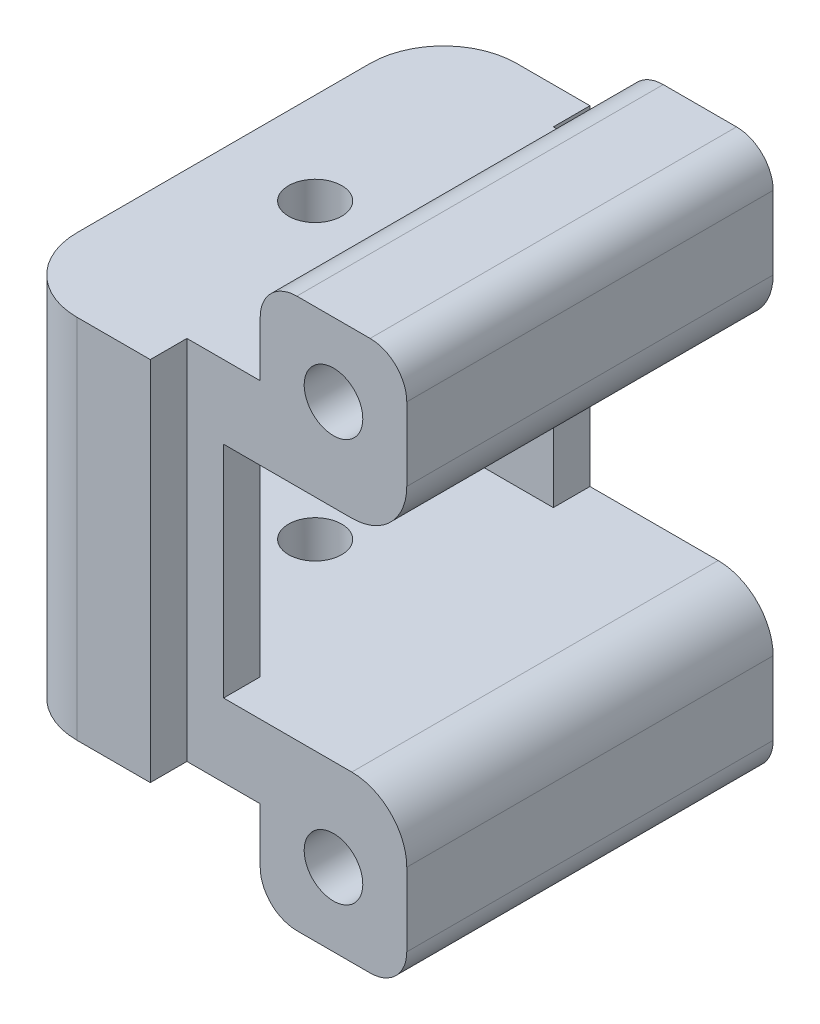
ISO-10303-21;
HEADER;
FILE_DESCRIPTION(('STEP AP214'),'2;1');
FILE_NAME('part.step','',(''),(''),'','','');
FILE_SCHEMA(('AUTOMOTIVE_DESIGN { 1 0 10303 214 1 1 1 1 }'));
ENDSEC;
DATA;
#1=APPLICATION_CONTEXT('core data for automotive mechanical design processes');
#2=APPLICATION_PROTOCOL_DEFINITION('international standard','automotive_design',2000,#1);
#3=PRODUCT_CONTEXT('',#1,'mechanical');
#4=PRODUCT('Part','Part','',(#3));
#5=PRODUCT_RELATED_PRODUCT_CATEGORY('part','',(#4));
#6=PRODUCT_DEFINITION_FORMATION('','',#4);
#7=PRODUCT_DEFINITION_CONTEXT('part definition',#1,'design');
#8=PRODUCT_DEFINITION('design','',#6,#7);
#9=PRODUCT_DEFINITION_SHAPE('','',#8);
#10=(LENGTH_UNIT() NAMED_UNIT(*) SI_UNIT(.MILLI.,.METRE.));
#11=(NAMED_UNIT(*) PLANE_ANGLE_UNIT() SI_UNIT($,.RADIAN.));
#12=(NAMED_UNIT(*) SI_UNIT($,.STERADIAN.) SOLID_ANGLE_UNIT());
#13=UNCERTAINTY_MEASURE_WITH_UNIT(LENGTH_MEASURE(1.E-05),#10,'distance_accuracy_value','');
#14=(GEOMETRIC_REPRESENTATION_CONTEXT(3) GLOBAL_UNCERTAINTY_ASSIGNED_CONTEXT((#13)) GLOBAL_UNIT_ASSIGNED_CONTEXT((#10,
#11,#12)) REPRESENTATION_CONTEXT('',''));
#15=CARTESIAN_POINT('',(0.,0.,0.));
#16=DIRECTION('',(0.,0.,1.));
#17=DIRECTION('',(1.,0.,0.));
#18=AXIS2_PLACEMENT_3D('',#15,#16,#17);
#19=CARTESIAN_POINT('',(6.,0.,0.));
#20=DIRECTION('',(1.,0.,0.));
#21=DIRECTION('',(0.,0.,-1.));
#22=AXIS2_PLACEMENT_3D('',#19,#20,#21);
#23=PLANE('',#22);
#24=DIRECTION('',(0.,0.,1.));
#25=VECTOR('',#24,1.);
#26=CARTESIAN_POINT('',(6.,0.,0.));
#27=LINE('',#26,#25);
#28=CARTESIAN_POINT('',(6.,0.,2.));
#29=VERTEX_POINT('',#28);
#30=CARTESIAN_POINT('',(6.,0.,18.));
#31=VERTEX_POINT('',#30);
#32=EDGE_CURVE('E225',#29,#31,#27,.T.);
#33=ORIENTED_EDGE('',*,*,#32,.F.);
#34=DIRECTION('',(0.,1.,0.));
#35=VECTOR('',#34,1.);
#36=CARTESIAN_POINT('',(6.,-20.,2.));
#37=LINE('',#36,#35);
#38=CARTESIAN_POINT('',(6.,-4.00000000000002,2.));
#39=VERTEX_POINT('',#38);
#40=EDGE_CURVE('E220',#29,#39,#37,.F.);
#41=ORIENTED_EDGE('',*,*,#40,.T.);
#42=DIRECTION('',(0.,0.,-1.));
#43=VECTOR('',#42,1.);
#44=CARTESIAN_POINT('',(6.,-4.,0.));
#45=LINE('',#44,#43);
#46=CARTESIAN_POINT('',(6.,-4.00000000000001,18.));
#47=VERTEX_POINT('',#46);
#48=EDGE_CURVE('E222',#47,#39,#45,.T.);
#49=ORIENTED_EDGE('',*,*,#48,.F.);
#50=DIRECTION('',(0.,-1.,0.));
#51=VECTOR('',#50,1.);
#52=CARTESIAN_POINT('',(6.,0.,18.));
#53=LINE('',#52,#51);
#54=EDGE_CURVE('E461',#47,#31,#53,.F.);
#55=ORIENTED_EDGE('',*,*,#54,.T.);
#56=EDGE_LOOP('',(#33,#41,#49,#55));
#57=FACE_BOUND('',#56,.T.);
#58=ADVANCED_FACE('F35',(#57),#23,.F.);
#59=CARTESIAN_POINT('',(4.,0.,0.));
#60=DIRECTION('',(0.,0.,1.));
#61=DIRECTION('',(0.,-1.,0.));
#62=AXIS2_PLACEMENT_3D('',#59,#60,#61);
#63=PLANE('',#62);
#64=CARTESIAN_POINT('',(22.,1.,0.));
#65=DIRECTION('',(0.,0.,-1.));
#66=DIRECTION('',(0.,1.,0.));
#67=AXIS2_PLACEMENT_3D('',#64,#65,#66);
#68=CIRCLE('',#67,1.6);
#69=CARTESIAN_POINT('',(22.,2.6,0.));
#70=VERTEX_POINT('',#69);
#71=EDGE_CURVE('E320',#70,#70,#68,.T.);
#72=ORIENTED_EDGE('',*,*,#71,.F.);
#73=EDGE_LOOP('',(#72));
#74=FACE_BOUND('',#73,.T.);
#75=CARTESIAN_POINT('',(21.9999999999991,-21.,0.));
#76=DIRECTION('',(0.,0.,-1.));
#77=DIRECTION('',(0.,1.,0.));
#78=AXIS2_PLACEMENT_3D('',#75,#76,#77);
#79=CIRCLE('',#78,1.6);
#80=CARTESIAN_POINT('',(21.9999999999991,-19.4,0.));
#81=VERTEX_POINT('',#80);
#82=EDGE_CURVE('E316',#81,#81,#79,.T.);
#83=ORIENTED_EDGE('',*,*,#82,.F.);
#84=EDGE_LOOP('',(#83));
#85=FACE_BOUND('',#84,.T.);
#86=DIRECTION('',(1.,0.,0.));
#87=VECTOR('',#86,1.);
#88=CARTESIAN_POINT('',(26.,-25.,0.));
#89=LINE('',#88,#87);
#90=CARTESIAN_POINT('',(20.,-25.,0.));
#91=VERTEX_POINT('',#90);
#92=CARTESIAN_POINT('',(24.,-25.,0.));
#93=VERTEX_POINT('',#92);
#94=EDGE_CURVE('E345',#91,#93,#89,.T.);
#95=ORIENTED_EDGE('',*,*,#94,.F.);
#96=CARTESIAN_POINT('',(20.,-23.,0.));
#97=DIRECTION('',(0.,0.,1.));
#98=DIRECTION('',(0.,-1.,0.));
#99=AXIS2_PLACEMENT_3D('',#96,#97,#98);
#100=CIRCLE('',#99,2.);
#101=CARTESIAN_POINT('',(18.,-23.,0.));
#102=VERTEX_POINT('',#101);
#103=EDGE_CURVE('E430',#91,#102,#100,.F.);
#104=ORIENTED_EDGE('',*,*,#103,.T.);
#105=DIRECTION('',(0.,1.,0.));
#106=VECTOR('',#105,1.);
#107=CARTESIAN_POINT('',(18.,-25.,0.));
#108=LINE('',#107,#106);
#109=CARTESIAN_POINT('',(18.,-20.,0.));
#110=VERTEX_POINT('',#109);
#111=EDGE_CURVE('E348',#102,#110,#108,.T.);
#112=ORIENTED_EDGE('',*,*,#111,.T.);
#113=DIRECTION('',(-1.,0.,0.));
#114=VECTOR('',#113,1.);
#115=CARTESIAN_POINT('',(4.,-20.,0.));
#116=LINE('',#115,#114);
#117=CARTESIAN_POINT('',(14.,-20.,0.));
#118=VERTEX_POINT('',#117);
#119=EDGE_CURVE('E384',#110,#118,#116,.T.);
#120=ORIENTED_EDGE('',*,*,#119,.T.);
#121=DIRECTION('',(0.,-1.,0.));
#122=VECTOR('',#121,1.);
#123=CARTESIAN_POINT('',(14.,-20.,0.));
#124=LINE('',#123,#122);
#125=CARTESIAN_POINT('',(14.,0.,0.));
#126=VERTEX_POINT('',#125);
#127=EDGE_CURVE('E269',#126,#118,#124,.T.);
#128=ORIENTED_EDGE('',*,*,#127,.F.);
#129=DIRECTION('',(-1.,0.,0.));
#130=VECTOR('',#129,1.);
#131=CARTESIAN_POINT('',(4.,0.,0.));
#132=LINE('',#131,#130);
#133=CARTESIAN_POINT('',(18.,0.,0.));
#134=VERTEX_POINT('',#133);
#135=EDGE_CURVE('E391',#134,#126,#132,.T.);
#136=ORIENTED_EDGE('',*,*,#135,.F.);
#137=DIRECTION('',(0.,-1.,0.));
#138=VECTOR('',#137,1.);
#139=CARTESIAN_POINT('',(18.,5.,0.));
#140=LINE('',#139,#138);
#141=CARTESIAN_POINT('',(18.,3.,0.));
#142=VERTEX_POINT('',#141);
#143=EDGE_CURVE('E339',#142,#134,#140,.T.);
#144=ORIENTED_EDGE('',*,*,#143,.F.);
#145=CARTESIAN_POINT('',(20.,3.,0.));
#146=DIRECTION('',(0.,0.,1.));
#147=DIRECTION('',(0.,-1.,0.));
#148=AXIS2_PLACEMENT_3D('',#145,#146,#147);
#149=CIRCLE('',#148,2.);
#150=CARTESIAN_POINT('',(20.,5.,0.));
#151=VERTEX_POINT('',#150);
#152=EDGE_CURVE('E426',#142,#151,#149,.F.);
#153=ORIENTED_EDGE('',*,*,#152,.T.);
#154=DIRECTION('',(-1.,0.,0.));
#155=VECTOR('',#154,1.);
#156=CARTESIAN_POINT('',(26.,5.,0.));
#157=LINE('',#156,#155);
#158=CARTESIAN_POINT('',(24.,5.,0.));
#159=VERTEX_POINT('',#158);
#160=EDGE_CURVE('E329',#159,#151,#157,.T.);
#161=ORIENTED_EDGE('',*,*,#160,.F.);
#162=CARTESIAN_POINT('',(24.,3.,0.));
#163=DIRECTION('',(0.,0.,1.));
#164=DIRECTION('',(0.,-1.,0.));
#165=AXIS2_PLACEMENT_3D('',#162,#163,#164);
#166=CIRCLE('',#165,2.);
#167=CARTESIAN_POINT('',(26.,3.,0.));
#168=VERTEX_POINT('',#167);
#169=EDGE_CURVE('E424',#159,#168,#166,.F.);
#170=ORIENTED_EDGE('',*,*,#169,.T.);
#171=DIRECTION('',(0.,1.,0.));
#172=VECTOR('',#171,1.);
#173=CARTESIAN_POINT('',(26.,0.,0.));
#174=LINE('',#173,#172);
#175=CARTESIAN_POINT('',(26.,-1.,0.));
#176=VERTEX_POINT('',#175);
#177=EDGE_CURVE('E355',#176,#168,#174,.T.);
#178=ORIENTED_EDGE('',*,*,#177,.F.);
#179=CARTESIAN_POINT('',(23.,-1.,0.));
#180=DIRECTION('',(0.,0.,1.));
#181=DIRECTION('',(0.,-1.,0.));
#182=AXIS2_PLACEMENT_3D('',#179,#180,#181);
#183=CIRCLE('',#182,3.);
#184=CARTESIAN_POINT('',(23.,-4.,0.));
#185=VERTEX_POINT('',#184);
#186=EDGE_CURVE('E408',#176,#185,#183,.F.);
#187=ORIENTED_EDGE('',*,*,#186,.T.);
#188=DIRECTION('',(-1.,0.,0.));
#189=VECTOR('',#188,1.);
#190=CARTESIAN_POINT('',(26.,-4.,0.));
#191=LINE('',#190,#189);
#192=CARTESIAN_POINT('',(16.,-4.,0.));
#193=VERTEX_POINT('',#192);
#194=EDGE_CURVE('E360',#185,#193,#191,.T.);
#195=ORIENTED_EDGE('',*,*,#194,.T.);
#196=DIRECTION('',(0.,1.,0.));
#197=VECTOR('',#196,1.);
#198=CARTESIAN_POINT('',(16.,0.,0.));
#199=LINE('',#198,#197);
#200=CARTESIAN_POINT('',(16.,-16.,0.));
#201=VERTEX_POINT('',#200);
#202=EDGE_CURVE('E378',#201,#193,#199,.T.);
#203=ORIENTED_EDGE('',*,*,#202,.F.);
#204=DIRECTION('',(-1.,0.,0.));
#205=VECTOR('',#204,1.);
#206=CARTESIAN_POINT('',(26.,-16.,0.));
#207=LINE('',#206,#205);
#208=CARTESIAN_POINT('',(23.,-16.,0.));
#209=VERTEX_POINT('',#208);
#210=EDGE_CURVE('E376',#209,#201,#207,.T.);
#211=ORIENTED_EDGE('',*,*,#210,.F.);
#212=CARTESIAN_POINT('',(23.,-19.,0.));
#213=DIRECTION('',(0.,0.,1.));
#214=DIRECTION('',(0.,-1.,0.));
#215=AXIS2_PLACEMENT_3D('',#212,#213,#214);
#216=CIRCLE('',#215,3.);
#217=CARTESIAN_POINT('',(26.,-19.,0.));
#218=VERTEX_POINT('',#217);
#219=EDGE_CURVE('E410',#209,#218,#216,.F.);
#220=ORIENTED_EDGE('',*,*,#219,.T.);
#221=DIRECTION('',(0.,1.,0.));
#222=VECTOR('',#221,1.);
#223=CARTESIAN_POINT('',(26.,-20.,0.));
#224=LINE('',#223,#222);
#225=CARTESIAN_POINT('',(26.,-23.,0.));
#226=VERTEX_POINT('',#225);
#227=EDGE_CURVE('E366',#226,#218,#224,.T.);
#228=ORIENTED_EDGE('',*,*,#227,.F.);
#229=CARTESIAN_POINT('',(24.,-23.,0.));
#230=DIRECTION('',(0.,0.,1.));
#231=DIRECTION('',(0.,-1.,0.));
#232=AXIS2_PLACEMENT_3D('',#229,#230,#231);
#233=CIRCLE('',#232,2.);
#234=EDGE_CURVE('E428',#226,#93,#233,.F.);
#235=ORIENTED_EDGE('',*,*,#234,.T.);
#236=EDGE_LOOP('',(#95,#104,#112,#120,#128,#136,#144,#153,#161,#170,#178,#187,#195,#203,#211,
#220,#228,#235));
#237=FACE_BOUND('',#236,.T.);
#238=ADVANCED_FACE('F502',(#74,#85,#237),#63,.F.);
#239=CARTESIAN_POINT('',(4.,0.,20.));
#240=DIRECTION('',(0.,0.,-1.));
#241=DIRECTION('',(-1.,0.,0.));
#242=AXIS2_PLACEMENT_3D('',#239,#240,#241);
#243=PLANE('',#242);
#244=CARTESIAN_POINT('',(22.,1.,20.));
#245=DIRECTION('',(0.,0.,-1.));
#246=DIRECTION('',(0.,1.,0.));
#247=AXIS2_PLACEMENT_3D('',#244,#245,#246);
#248=CIRCLE('',#247,1.6);
#249=CARTESIAN_POINT('',(22.,2.6,20.));
#250=VERTEX_POINT('',#249);
#251=EDGE_CURVE('E323',#250,#250,#248,.T.);
#252=ORIENTED_EDGE('',*,*,#251,.T.);
#253=EDGE_LOOP('',(#252));
#254=FACE_BOUND('',#253,.T.);
#255=CARTESIAN_POINT('',(21.9999999999991,-21.,20.));
#256=DIRECTION('',(0.,0.,-1.));
#257=DIRECTION('',(0.,1.,0.));
#258=AXIS2_PLACEMENT_3D('',#255,#256,#257);
#259=CIRCLE('',#258,1.6);
#260=CARTESIAN_POINT('',(21.9999999999991,-19.4,20.));
#261=VERTEX_POINT('',#260);
#262=EDGE_CURVE('E317',#261,#261,#259,.T.);
#263=ORIENTED_EDGE('',*,*,#262,.T.);
#264=EDGE_LOOP('',(#263));
#265=FACE_BOUND('',#264,.T.);
#266=DIRECTION('',(0.,1.,0.));
#267=VECTOR('',#266,1.);
#268=CARTESIAN_POINT('',(18.,-25.,20.));
#269=LINE('',#268,#267);
#270=CARTESIAN_POINT('',(18.,-23.,20.));
#271=VERTEX_POINT('',#270);
#272=CARTESIAN_POINT('',(18.,-20.,20.));
#273=VERTEX_POINT('',#272);
#274=EDGE_CURVE('E352',#271,#273,#269,.T.);
#275=ORIENTED_EDGE('',*,*,#274,.F.);
#276=CARTESIAN_POINT('',(20.,-23.,20.));
#277=DIRECTION('',(0.,0.,-1.));
#278=DIRECTION('',(-1.,0.,0.));
#279=AXIS2_PLACEMENT_3D('',#276,#277,#278);
#280=CIRCLE('',#279,2.);
#281=CARTESIAN_POINT('',(20.,-25.,20.));
#282=VERTEX_POINT('',#281);
#283=EDGE_CURVE('E440',#271,#282,#280,.F.);
#284=ORIENTED_EDGE('',*,*,#283,.T.);
#285=DIRECTION('',(-1.,0.,0.));
#286=VECTOR('',#285,1.);
#287=CARTESIAN_POINT('',(26.,-25.,20.));
#288=LINE('',#287,#286);
#289=CARTESIAN_POINT('',(24.,-25.,20.));
#290=VERTEX_POINT('',#289);
#291=EDGE_CURVE('E342',#290,#282,#288,.T.);
#292=ORIENTED_EDGE('',*,*,#291,.F.);
#293=CARTESIAN_POINT('',(24.,-23.,20.));
#294=DIRECTION('',(0.,0.,-1.));
#295=DIRECTION('',(-1.,0.,0.));
#296=AXIS2_PLACEMENT_3D('',#293,#294,#295);
#297=CIRCLE('',#296,2.);
#298=CARTESIAN_POINT('',(26.,-23.,20.));
#299=VERTEX_POINT('',#298);
#300=EDGE_CURVE('E438',#290,#299,#297,.F.);
#301=ORIENTED_EDGE('',*,*,#300,.T.);
#302=DIRECTION('',(0.,-1.,0.));
#303=VECTOR('',#302,1.);
#304=CARTESIAN_POINT('',(26.,-20.,20.));
#305=LINE('',#304,#303);
#306=CARTESIAN_POINT('',(26.,-19.,20.));
#307=VERTEX_POINT('',#306);
#308=EDGE_CURVE('E368',#307,#299,#305,.T.);
#309=ORIENTED_EDGE('',*,*,#308,.F.);
#310=CARTESIAN_POINT('',(23.,-19.,20.));
#311=DIRECTION('',(0.,0.,-1.));
#312=DIRECTION('',(-1.,0.,0.));
#313=AXIS2_PLACEMENT_3D('',#310,#311,#312);
#314=CIRCLE('',#313,3.);
#315=CARTESIAN_POINT('',(23.,-16.,20.));
#316=VERTEX_POINT('',#315);
#317=EDGE_CURVE('E404',#307,#316,#314,.F.);
#318=ORIENTED_EDGE('',*,*,#317,.T.);
#319=DIRECTION('',(-1.,0.,0.));
#320=VECTOR('',#319,1.);
#321=CARTESIAN_POINT('',(26.,-16.,20.));
#322=LINE('',#321,#320);
#323=CARTESIAN_POINT('',(16.,-16.,20.));
#324=VERTEX_POINT('',#323);
#325=EDGE_CURVE('E371',#316,#324,#322,.T.);
#326=ORIENTED_EDGE('',*,*,#325,.T.);
#327=DIRECTION('',(0.,-1.,0.));
#328=VECTOR('',#327,1.);
#329=CARTESIAN_POINT('',(16.,0.,20.));
#330=LINE('',#329,#328);
#331=CARTESIAN_POINT('',(16.,-4.,20.));
#332=VERTEX_POINT('',#331);
#333=EDGE_CURVE('E381',#332,#324,#330,.T.);
#334=ORIENTED_EDGE('',*,*,#333,.F.);
#335=DIRECTION('',(-1.,0.,0.));
#336=VECTOR('',#335,1.);
#337=CARTESIAN_POINT('',(26.,-4.,20.));
#338=LINE('',#337,#336);
#339=CARTESIAN_POINT('',(23.,-4.,20.));
#340=VERTEX_POINT('',#339);
#341=EDGE_CURVE('E363',#340,#332,#338,.T.);
#342=ORIENTED_EDGE('',*,*,#341,.F.);
#343=CARTESIAN_POINT('',(23.,-1.,20.));
#344=DIRECTION('',(0.,0.,-1.));
#345=DIRECTION('',(-1.,0.,0.));
#346=AXIS2_PLACEMENT_3D('',#343,#344,#345);
#347=CIRCLE('',#346,3.);
#348=CARTESIAN_POINT('',(26.,-1.,20.));
#349=VERTEX_POINT('',#348);
#350=EDGE_CURVE('E401',#340,#349,#347,.F.);
#351=ORIENTED_EDGE('',*,*,#350,.T.);
#352=DIRECTION('',(0.,-1.,0.));
#353=VECTOR('',#352,1.);
#354=CARTESIAN_POINT('',(26.,0.,20.));
#355=LINE('',#354,#353);
#356=CARTESIAN_POINT('',(26.,3.,20.));
#357=VERTEX_POINT('',#356);
#358=EDGE_CURVE('E358',#357,#349,#355,.T.);
#359=ORIENTED_EDGE('',*,*,#358,.F.);
#360=CARTESIAN_POINT('',(24.,3.,20.));
#361=DIRECTION('',(0.,0.,-1.));
#362=DIRECTION('',(-1.,0.,0.));
#363=AXIS2_PLACEMENT_3D('',#360,#361,#362);
#364=CIRCLE('',#363,2.);
#365=CARTESIAN_POINT('',(24.,5.,20.));
#366=VERTEX_POINT('',#365);
#367=EDGE_CURVE('E434',#357,#366,#364,.F.);
#368=ORIENTED_EDGE('',*,*,#367,.T.);
#369=DIRECTION('',(1.,0.,0.));
#370=VECTOR('',#369,1.);
#371=CARTESIAN_POINT('',(26.,5.,20.));
#372=LINE('',#371,#370);
#373=CARTESIAN_POINT('',(20.,5.,20.));
#374=VERTEX_POINT('',#373);
#375=EDGE_CURVE('E332',#374,#366,#372,.T.);
#376=ORIENTED_EDGE('',*,*,#375,.F.);
#377=CARTESIAN_POINT('',(20.,3.,20.));
#378=DIRECTION('',(0.,0.,-1.));
#379=DIRECTION('',(-1.,0.,0.));
#380=AXIS2_PLACEMENT_3D('',#377,#378,#379);
#381=CIRCLE('',#380,2.);
#382=CARTESIAN_POINT('',(18.,3.,20.));
#383=VERTEX_POINT('',#382);
#384=EDGE_CURVE('E436',#374,#383,#381,.F.);
#385=ORIENTED_EDGE('',*,*,#384,.T.);
#386=DIRECTION('',(0.,-1.,0.));
#387=VECTOR('',#386,1.);
#388=CARTESIAN_POINT('',(18.,5.,20.));
#389=LINE('',#388,#387);
#390=CARTESIAN_POINT('',(18.,0.,20.));
#391=VERTEX_POINT('',#390);
#392=EDGE_CURVE('E335',#383,#391,#389,.T.);
#393=ORIENTED_EDGE('',*,*,#392,.T.);
#394=DIRECTION('',(-1.,0.,0.));
#395=VECTOR('',#394,1.);
#396=CARTESIAN_POINT('',(4.,0.,20.));
#397=LINE('',#396,#395);
#398=CARTESIAN_POINT('',(14.,0.,20.));
#399=VERTEX_POINT('',#398);
#400=EDGE_CURVE('E389',#391,#399,#397,.T.);
#401=ORIENTED_EDGE('',*,*,#400,.T.);
#402=DIRECTION('',(0.,1.,0.));
#403=VECTOR('',#402,1.);
#404=CARTESIAN_POINT('',(14.,-20.,20.));
#405=LINE('',#404,#403);
#406=CARTESIAN_POINT('',(14.,-20.,20.));
#407=VERTEX_POINT('',#406);
#408=EDGE_CURVE('E285',#407,#399,#405,.T.);
#409=ORIENTED_EDGE('',*,*,#408,.F.);
#410=DIRECTION('',(-1.,0.,0.));
#411=VECTOR('',#410,1.);
#412=CARTESIAN_POINT('',(4.,-20.,20.));
#413=LINE('',#412,#411);
#414=EDGE_CURVE('E386',#273,#407,#413,.T.);
#415=ORIENTED_EDGE('',*,*,#414,.F.);
#416=EDGE_LOOP('',(#275,#284,#292,#301,#309,#318,#326,#334,#342,#351,#359,#368,#376,#385,#393,
#401,#409,#415));
#417=FACE_BOUND('',#416,.T.);
#418=ADVANCED_FACE('F493',(#254,#265,#417),#243,.F.);
#419=CARTESIAN_POINT('',(4.,0.,0.));
#420=DIRECTION('',(0.,-1.,0.));
#421=DIRECTION('',(0.,0.,-1.));
#422=AXIS2_PLACEMENT_3D('',#419,#420,#421);
#423=PLANE('',#422);
#424=CARTESIAN_POINT('',(11.,0.,10.));
#425=DIRECTION('',(0.,1.,0.));
#426=DIRECTION('',(0.,0.,1.));
#427=AXIS2_PLACEMENT_3D('',#424,#425,#426);
#428=CIRCLE('',#427,1.45);
#429=CARTESIAN_POINT('',(11.,0.,11.45));
#430=VERTEX_POINT('',#429);
#431=EDGE_CURVE('E301',#430,#430,#428,.T.);
#432=ORIENTED_EDGE('',*,*,#431,.F.);
#433=EDGE_LOOP('',(#432));
#434=FACE_BOUND('',#433,.T.);
#435=DIRECTION('',(1.,0.,0.));
#436=VECTOR('',#435,1.);
#437=CARTESIAN_POINT('',(6.,0.,-2.));
#438=LINE('',#437,#436);
#439=CARTESIAN_POINT('',(10.,0.,-2.));
#440=VERTEX_POINT('',#439);
#441=CARTESIAN_POINT('',(14.,0.,-2.));
#442=VERTEX_POINT('',#441);
#443=EDGE_CURVE('E270',#440,#442,#438,.T.);
#444=ORIENTED_EDGE('',*,*,#443,.F.);
#445=CARTESIAN_POINT('',(10.,0.,2.));
#446=DIRECTION('',(0.,-1.,0.));
#447=DIRECTION('',(0.,0.,-1.));
#448=AXIS2_PLACEMENT_3D('',#445,#446,#447);
#449=CIRCLE('',#448,4.);
#450=EDGE_CURVE('E459',#440,#29,#449,.F.);
#451=ORIENTED_EDGE('',*,*,#450,.T.);
#452=ORIENTED_EDGE('',*,*,#32,.T.);
#453=CARTESIAN_POINT('',(10.,0.,18.));
#454=DIRECTION('',(0.,-1.,0.));
#455=DIRECTION('',(0.,0.,-1.));
#456=AXIS2_PLACEMENT_3D('',#453,#454,#455);
#457=CIRCLE('',#456,4.);
#458=CARTESIAN_POINT('',(10.,0.,22.));
#459=VERTEX_POINT('',#458);
#460=EDGE_CURVE('E457',#31,#459,#457,.F.);
#461=ORIENTED_EDGE('',*,*,#460,.T.);
#462=DIRECTION('',(-1.,0.,0.));
#463=VECTOR('',#462,1.);
#464=CARTESIAN_POINT('',(6.,0.,22.));
#465=LINE('',#464,#463);
#466=CARTESIAN_POINT('',(14.,0.,22.));
#467=VERTEX_POINT('',#466);
#468=EDGE_CURVE('E290',#467,#459,#465,.T.);
#469=ORIENTED_EDGE('',*,*,#468,.F.);
#470=DIRECTION('',(0.,0.,-1.));
#471=VECTOR('',#470,1.);
#472=CARTESIAN_POINT('',(14.,0.,22.));
#473=LINE('',#472,#471);
#474=EDGE_CURVE('E293',#467,#399,#473,.T.);
#475=ORIENTED_EDGE('',*,*,#474,.T.);
#476=ORIENTED_EDGE('',*,*,#400,.F.);
#477=DIRECTION('',(0.,0.,1.));
#478=VECTOR('',#477,1.);
#479=CARTESIAN_POINT('',(18.,0.,0.));
#480=LINE('',#479,#478);
#481=EDGE_CURVE('E326',#134,#391,#480,.T.);
#482=ORIENTED_EDGE('',*,*,#481,.F.);
#483=ORIENTED_EDGE('',*,*,#135,.T.);
#484=DIRECTION('',(0.,0.,1.));
#485=VECTOR('',#484,1.);
#486=CARTESIAN_POINT('',(14.,0.,-2.));
#487=LINE('',#486,#485);
#488=EDGE_CURVE('E282',#442,#126,#487,.T.);
#489=ORIENTED_EDGE('',*,*,#488,.F.);
#490=EDGE_LOOP('',(#444,#451,#452,#461,#469,#475,#476,#482,#483,#489));
#491=FACE_BOUND('',#490,.T.);
#492=ADVANCED_FACE('F475',(#434,#491),#423,.F.);
#493=CARTESIAN_POINT('',(4.,-20.,0.));
#494=DIRECTION('',(0.,1.,0.));
#495=DIRECTION('',(0.,0.,1.));
#496=AXIS2_PLACEMENT_3D('',#493,#494,#495);
#497=PLANE('',#496);
#498=CARTESIAN_POINT('',(11.,-20.,10.));
#499=DIRECTION('',(0.,1.,0.));
#500=DIRECTION('',(0.,0.,1.));
#501=AXIS2_PLACEMENT_3D('',#498,#499,#500);
#502=CIRCLE('',#501,1.45);
#503=CARTESIAN_POINT('',(11.,-20.,11.45));
#504=VERTEX_POINT('',#503);
#505=EDGE_CURVE('E308',#504,#504,#502,.T.);
#506=ORIENTED_EDGE('',*,*,#505,.T.);
#507=EDGE_LOOP('',(#506));
#508=FACE_BOUND('',#507,.T.);
#509=DIRECTION('',(0.,0.,1.));
#510=VECTOR('',#509,1.);
#511=CARTESIAN_POINT('',(6.,-20.,0.));
#512=LINE('',#511,#510);
#513=CARTESIAN_POINT('',(6.,-20.,2.));
#514=VERTEX_POINT('',#513);
#515=CARTESIAN_POINT('',(6.,-20.,18.));
#516=VERTEX_POINT('',#515);
#517=EDGE_CURVE('E311',#514,#516,#512,.T.);
#518=ORIENTED_EDGE('',*,*,#517,.F.);
#519=CARTESIAN_POINT('',(10.,-20.,2.));
#520=DIRECTION('',(0.,1.,0.));
#521=DIRECTION('',(0.,0.,1.));
#522=AXIS2_PLACEMENT_3D('',#519,#520,#521);
#523=CIRCLE('',#522,4.);
#524=CARTESIAN_POINT('',(10.,-20.,-2.));
#525=VERTEX_POINT('',#524);
#526=EDGE_CURVE('E43',#514,#525,#523,.F.);
#527=ORIENTED_EDGE('',*,*,#526,.T.);
#528=DIRECTION('',(-1.,0.,0.));
#529=VECTOR('',#528,1.);
#530=CARTESIAN_POINT('',(6.,-20.,-2.));
#531=LINE('',#530,#529);
#532=CARTESIAN_POINT('',(14.,-20.,-2.));
#533=VERTEX_POINT('',#532);
#534=EDGE_CURVE('E274',#533,#525,#531,.T.);
#535=ORIENTED_EDGE('',*,*,#534,.F.);
#536=DIRECTION('',(0.,0.,1.));
#537=VECTOR('',#536,1.);
#538=CARTESIAN_POINT('',(14.,-20.,-2.));
#539=LINE('',#538,#537);
#540=EDGE_CURVE('E277',#533,#118,#539,.T.);
#541=ORIENTED_EDGE('',*,*,#540,.T.);
#542=ORIENTED_EDGE('',*,*,#119,.F.);
#543=DIRECTION('',(0.,0.,-1.));
#544=VECTOR('',#543,1.);
#545=CARTESIAN_POINT('',(18.,-20.,0.));
#546=LINE('',#545,#544);
#547=EDGE_CURVE('E341',#273,#110,#546,.T.);
#548=ORIENTED_EDGE('',*,*,#547,.F.);
#549=ORIENTED_EDGE('',*,*,#414,.T.);
#550=DIRECTION('',(0.,0.,-1.));
#551=VECTOR('',#550,1.);
#552=CARTESIAN_POINT('',(14.,-20.,22.));
#553=LINE('',#552,#551);
#554=CARTESIAN_POINT('',(14.,-20.,22.));
#555=VERTEX_POINT('',#554);
#556=EDGE_CURVE('E298',#555,#407,#553,.T.);
#557=ORIENTED_EDGE('',*,*,#556,.F.);
#558=DIRECTION('',(1.,0.,0.));
#559=VECTOR('',#558,1.);
#560=CARTESIAN_POINT('',(6.,-20.,22.));
#561=LINE('',#560,#559);
#562=CARTESIAN_POINT('',(10.,-20.,22.));
#563=VERTEX_POINT('',#562);
#564=EDGE_CURVE('E286',#563,#555,#561,.T.);
#565=ORIENTED_EDGE('',*,*,#564,.F.);
#566=CARTESIAN_POINT('',(10.,-20.,18.));
#567=DIRECTION('',(0.,1.,0.));
#568=DIRECTION('',(0.,0.,1.));
#569=AXIS2_PLACEMENT_3D('',#566,#567,#568);
#570=CIRCLE('',#569,4.);
#571=EDGE_CURVE('E50',#563,#516,#570,.F.);
#572=ORIENTED_EDGE('',*,*,#571,.T.);
#573=EDGE_LOOP('',(#518,#527,#535,#541,#542,#548,#549,#557,#565,#572));
#574=FACE_BOUND('',#573,.T.);
#575=ADVANCED_FACE('F467',(#508,#574),#497,.F.);
#576=CARTESIAN_POINT('',(16.,0.,0.));
#577=DIRECTION('',(1.,0.,0.));
#578=DIRECTION('',(0.,0.,-1.));
#579=AXIS2_PLACEMENT_3D('',#576,#577,#578);
#580=PLANE('',#579);
#581=DIRECTION('',(0.,1.,0.));
#582=VECTOR('',#581,1.);
#583=CARTESIAN_POINT('',(16.,0.,2.));
#584=LINE('',#583,#582);
#585=CARTESIAN_POINT('',(16.,-16.,2.));
#586=VERTEX_POINT('',#585);
#587=CARTESIAN_POINT('',(16.,-4.00000000000002,2.));
#588=VERTEX_POINT('',#587);
#589=EDGE_CURVE('E251',#586,#588,#584,.T.);
#590=ORIENTED_EDGE('',*,*,#589,.F.);
#591=DIRECTION('',(0.,0.,1.));
#592=VECTOR('',#591,1.);
#593=CARTESIAN_POINT('',(16.,-16.,0.));
#594=LINE('',#593,#592);
#595=EDGE_CURVE('E365',#201,#586,#594,.T.);
#596=ORIENTED_EDGE('',*,*,#595,.F.);
#597=ORIENTED_EDGE('',*,*,#202,.T.);
#598=DIRECTION('',(0.,0.,1.));
#599=VECTOR('',#598,1.);
#600=CARTESIAN_POINT('',(16.,-4.,0.));
#601=LINE('',#600,#599);
#602=EDGE_CURVE('E394',#193,#588,#601,.T.);
#603=ORIENTED_EDGE('',*,*,#602,.T.);
#604=EDGE_LOOP('',(#590,#596,#597,#603));
#605=FACE_BOUND('',#604,.T.);
#606=ADVANCED_FACE('F601',(#605),#580,.T.);
#607=DIRECTION('',(0.,-1.,0.));
#608=VECTOR('',#607,1.);
#609=CARTESIAN_POINT('',(16.,0.,18.));
#610=LINE('',#609,#608);
#611=CARTESIAN_POINT('',(16.,-4.00000000000001,18.));
#612=VERTEX_POINT('',#611);
#613=CARTESIAN_POINT('',(16.,-16.,18.));
#614=VERTEX_POINT('',#613);
#615=EDGE_CURVE('E267',#612,#614,#610,.T.);
#616=ORIENTED_EDGE('',*,*,#615,.F.);
#617=DIRECTION('',(0.,0.,-1.));
#618=VECTOR('',#617,1.);
#619=CARTESIAN_POINT('',(16.,-4.,0.));
#620=LINE('',#619,#618);
#621=EDGE_CURVE('E354',#332,#612,#620,.T.);
#622=ORIENTED_EDGE('',*,*,#621,.F.);
#623=ORIENTED_EDGE('',*,*,#333,.T.);
#624=EDGE_CURVE('E374',#614,#324,#594,.T.);
#625=ORIENTED_EDGE('',*,*,#624,.F.);
#626=EDGE_LOOP('',(#616,#622,#623,#625));
#627=FACE_BOUND('',#626,.T.);
#628=ADVANCED_FACE('F528',(#627),#580,.T.);
#629=CARTESIAN_POINT('',(16.,-4.,0.));
#630=DIRECTION('',(0.,1.,0.));
#631=DIRECTION('',(0.,0.,1.));
#632=AXIS2_PLACEMENT_3D('',#629,#630,#631);
#633=PLANE('',#632);
#634=ORIENTED_EDGE('',*,*,#194,.F.);
#635=DIRECTION('',(0.,0.,-1.));
#636=VECTOR('',#635,1.);
#637=CARTESIAN_POINT('',(23.,-4.,0.));
#638=LINE('',#637,#636);
#639=EDGE_CURVE('E416',#185,#340,#638,.F.);
#640=ORIENTED_EDGE('',*,*,#639,.T.);
#641=ORIENTED_EDGE('',*,*,#341,.T.);
#642=ORIENTED_EDGE('',*,*,#621,.T.);
#643=DIRECTION('',(-1.,0.,0.));
#644=VECTOR('',#643,1.);
#645=CARTESIAN_POINT('',(26.,-4.00000000000001,18.));
#646=LINE('',#645,#644);
#647=EDGE_CURVE('E241',#612,#47,#646,.T.);
#648=ORIENTED_EDGE('',*,*,#647,.T.);
#649=ORIENTED_EDGE('',*,*,#48,.T.);
#650=DIRECTION('',(-1.,0.,0.));
#651=VECTOR('',#650,1.);
#652=CARTESIAN_POINT('',(26.,-4.00000000000002,2.));
#653=LINE('',#652,#651);
#654=EDGE_CURVE('E238',#588,#39,#653,.T.);
#655=ORIENTED_EDGE('',*,*,#654,.F.);
#656=ORIENTED_EDGE('',*,*,#602,.F.);
#657=EDGE_LOOP('',(#634,#640,#641,#642,#648,#649,#655,#656));
#658=FACE_BOUND('',#657,.T.);
#659=CARTESIAN_POINT('',(11.,-4.,10.));
#660=DIRECTION('',(0.,1.,0.));
#661=DIRECTION('',(0.,0.,1.));
#662=AXIS2_PLACEMENT_3D('',#659,#660,#661);
#663=CIRCLE('',#662,1.45);
#664=CARTESIAN_POINT('',(11.,-4.,11.45));
#665=VERTEX_POINT('',#664);
#666=EDGE_CURVE('E305',#665,#665,#663,.T.);
#667=ORIENTED_EDGE('',*,*,#666,.T.);
#668=EDGE_LOOP('',(#667));
#669=FACE_BOUND('',#668,.T.);
#670=ADVANCED_FACE('F235',(#658,#669),#633,.F.);
#671=CARTESIAN_POINT('',(16.,-16.,0.));
#672=DIRECTION('',(0.,-1.,0.));
#673=DIRECTION('',(0.,0.,-1.));
#674=AXIS2_PLACEMENT_3D('',#671,#672,#673);
#675=PLANE('',#674);
#676=ORIENTED_EDGE('',*,*,#325,.F.);
#677=DIRECTION('',(0.,0.,1.));
#678=VECTOR('',#677,1.);
#679=CARTESIAN_POINT('',(23.,-16.,0.));
#680=LINE('',#679,#678);
#681=EDGE_CURVE('E406',#316,#209,#680,.F.);
#682=ORIENTED_EDGE('',*,*,#681,.T.);
#683=ORIENTED_EDGE('',*,*,#210,.T.);
#684=ORIENTED_EDGE('',*,*,#595,.T.);
#685=DIRECTION('',(-1.,0.,0.));
#686=VECTOR('',#685,1.);
#687=CARTESIAN_POINT('',(26.,-16.,2.));
#688=LINE('',#687,#686);
#689=CARTESIAN_POINT('',(6.,-16.,2.));
#690=VERTEX_POINT('',#689);
#691=EDGE_CURVE('E252',#586,#690,#688,.T.);
#692=ORIENTED_EDGE('',*,*,#691,.T.);
#693=DIRECTION('',(0.,0.,1.));
#694=VECTOR('',#693,1.);
#695=CARTESIAN_POINT('',(6.,-16.,0.));
#696=LINE('',#695,#694);
#697=CARTESIAN_POINT('',(6.,-16.,18.));
#698=VERTEX_POINT('',#697);
#699=EDGE_CURVE('E243',#690,#698,#696,.T.);
#700=ORIENTED_EDGE('',*,*,#699,.T.);
#701=DIRECTION('',(-1.,0.,0.));
#702=VECTOR('',#701,1.);
#703=CARTESIAN_POINT('',(26.,-16.,18.));
#704=LINE('',#703,#702);
#705=EDGE_CURVE('E261',#614,#698,#704,.T.);
#706=ORIENTED_EDGE('',*,*,#705,.F.);
#707=ORIENTED_EDGE('',*,*,#624,.T.);
#708=EDGE_LOOP('',(#676,#682,#683,#684,#692,#700,#706,#707));
#709=FACE_BOUND('',#708,.T.);
#710=CARTESIAN_POINT('',(11.,-16.,10.));
#711=DIRECTION('',(0.,-1.,0.));
#712=DIRECTION('',(0.,0.,-1.));
#713=AXIS2_PLACEMENT_3D('',#710,#711,#712);
#714=CIRCLE('',#713,1.45);
#715=CARTESIAN_POINT('',(11.,-16.,8.55));
#716=VERTEX_POINT('',#715);
#717=EDGE_CURVE('E304',#716,#716,#714,.T.);
#718=ORIENTED_EDGE('',*,*,#717,.T.);
#719=EDGE_LOOP('',(#718));
#720=FACE_BOUND('',#719,.T.);
#721=ADVANCED_FACE('F520',(#709,#720),#675,.F.);
#722=CARTESIAN_POINT('',(26.,0.,0.));
#723=DIRECTION('',(1.,0.,0.));
#724=DIRECTION('',(0.,0.,-1.));
#725=AXIS2_PLACEMENT_3D('',#722,#723,#724);
#726=PLANE('',#725);
#727=ORIENTED_EDGE('',*,*,#308,.T.);
#728=DIRECTION('',(0.,0.,1.));
#729=VECTOR('',#728,1.);
#730=CARTESIAN_POINT('',(26.,-23.,0.));
#731=LINE('',#730,#729);
#732=EDGE_CURVE('E442',#299,#226,#731,.F.);
#733=ORIENTED_EDGE('',*,*,#732,.T.);
#734=ORIENTED_EDGE('',*,*,#227,.T.);
#735=DIRECTION('',(0.,0.,1.));
#736=VECTOR('',#735,1.);
#737=CARTESIAN_POINT('',(26.,-19.,20.));
#738=LINE('',#737,#736);
#739=EDGE_CURVE('E396',#218,#307,#738,.T.);
#740=ORIENTED_EDGE('',*,*,#739,.T.);
#741=EDGE_LOOP('',(#727,#733,#734,#740));
#742=FACE_BOUND('',#741,.T.);
#743=ADVANCED_FACE('F510',(#742),#726,.T.);
#744=CARTESIAN_POINT('',(26.,0.,0.));
#745=DIRECTION('',(-1.,0.,0.));
#746=DIRECTION('',(0.,0.,1.));
#747=AXIS2_PLACEMENT_3D('',#744,#745,#746);
#748=PLANE('',#747);
#749=ORIENTED_EDGE('',*,*,#177,.T.);
#750=DIRECTION('',(0.,0.,-1.));
#751=VECTOR('',#750,1.);
#752=CARTESIAN_POINT('',(26.,3.,0.));
#753=LINE('',#752,#751);
#754=EDGE_CURVE('E452',#168,#357,#753,.F.);
#755=ORIENTED_EDGE('',*,*,#754,.T.);
#756=ORIENTED_EDGE('',*,*,#358,.T.);
#757=DIRECTION('',(0.,0.,-1.));
#758=VECTOR('',#757,1.);
#759=CARTESIAN_POINT('',(26.,-1.,0.));
#760=LINE('',#759,#758);
#761=EDGE_CURVE('E413',#349,#176,#760,.T.);
#762=ORIENTED_EDGE('',*,*,#761,.T.);
#763=EDGE_LOOP('',(#749,#755,#756,#762));
#764=FACE_BOUND('',#763,.T.);
#765=ADVANCED_FACE('F538',(#764),#748,.F.);
#766=CARTESIAN_POINT('',(18.,-25.,0.));
#767=DIRECTION('',(1.,0.,0.));
#768=DIRECTION('',(0.,0.,-1.));
#769=AXIS2_PLACEMENT_3D('',#766,#767,#768);
#770=PLANE('',#769);
#771=ORIENTED_EDGE('',*,*,#111,.F.);
#772=DIRECTION('',(0.,0.,-1.));
#773=VECTOR('',#772,1.);
#774=CARTESIAN_POINT('',(18.,-23.,20.));
#775=LINE('',#774,#773);
#776=EDGE_CURVE('E432',#102,#271,#775,.F.);
#777=ORIENTED_EDGE('',*,*,#776,.T.);
#778=ORIENTED_EDGE('',*,*,#274,.T.);
#779=ORIENTED_EDGE('',*,*,#547,.T.);
#780=EDGE_LOOP('',(#771,#777,#778,#779));
#781=FACE_BOUND('',#780,.T.);
#782=ADVANCED_FACE('F488',(#781),#770,.F.);
#783=CARTESIAN_POINT('',(0.,-25.,0.));
#784=DIRECTION('',(0.,-1.,0.));
#785=DIRECTION('',(0.,0.,-1.));
#786=AXIS2_PLACEMENT_3D('',#783,#784,#785);
#787=PLANE('',#786);
#788=ORIENTED_EDGE('',*,*,#291,.T.);
#789=DIRECTION('',(0.,0.,-1.));
#790=VECTOR('',#789,1.);
#791=CARTESIAN_POINT('',(20.,-25.,0.));
#792=LINE('',#791,#790);
#793=EDGE_CURVE('E421',#282,#91,#792,.T.);
#794=ORIENTED_EDGE('',*,*,#793,.T.);
#795=ORIENTED_EDGE('',*,*,#94,.T.);
#796=DIRECTION('',(0.,0.,1.));
#797=VECTOR('',#796,1.);
#798=CARTESIAN_POINT('',(24.,-25.,0.));
#799=LINE('',#798,#797);
#800=EDGE_CURVE('E418',#93,#290,#799,.T.);
#801=ORIENTED_EDGE('',*,*,#800,.T.);
#802=EDGE_LOOP('',(#788,#794,#795,#801));
#803=FACE_BOUND('',#802,.T.);
#804=ADVANCED_FACE('F500',(#803),#787,.T.);
#805=CARTESIAN_POINT('',(18.,5.,0.));
#806=DIRECTION('',(1.,0.,0.));
#807=DIRECTION('',(0.,0.,-1.));
#808=AXIS2_PLACEMENT_3D('',#805,#806,#807);
#809=PLANE('',#808);
#810=ORIENTED_EDGE('',*,*,#392,.F.);
#811=DIRECTION('',(0.,0.,1.));
#812=VECTOR('',#811,1.);
#813=CARTESIAN_POINT('',(18.,3.,0.));
#814=LINE('',#813,#812);
#815=EDGE_CURVE('E450',#383,#142,#814,.F.);
#816=ORIENTED_EDGE('',*,*,#815,.T.);
#817=ORIENTED_EDGE('',*,*,#143,.T.);
#818=ORIENTED_EDGE('',*,*,#481,.T.);
#819=EDGE_LOOP('',(#810,#816,#817,#818));
#820=FACE_BOUND('',#819,.T.);
#821=ADVANCED_FACE('F554',(#820),#809,.F.);
#822=CARTESIAN_POINT('',(0.,5.,0.));
#823=DIRECTION('',(0.,-1.,0.));
#824=DIRECTION('',(0.,0.,-1.));
#825=AXIS2_PLACEMENT_3D('',#822,#823,#824);
#826=PLANE('',#825);
#827=ORIENTED_EDGE('',*,*,#160,.T.);
#828=DIRECTION('',(0.,0.,1.));
#829=VECTOR('',#828,1.);
#830=CARTESIAN_POINT('',(20.,5.,0.));
#831=LINE('',#830,#829);
#832=EDGE_CURVE('E447',#151,#374,#831,.T.);
#833=ORIENTED_EDGE('',*,*,#832,.T.);
#834=ORIENTED_EDGE('',*,*,#375,.T.);
#835=DIRECTION('',(0.,0.,-1.));
#836=VECTOR('',#835,1.);
#837=CARTESIAN_POINT('',(24.,5.,0.));
#838=LINE('',#837,#836);
#839=EDGE_CURVE('E444',#366,#159,#838,.T.);
#840=ORIENTED_EDGE('',*,*,#839,.T.);
#841=EDGE_LOOP('',(#827,#833,#834,#840));
#842=FACE_BOUND('',#841,.T.);
#843=ADVANCED_FACE('F546',(#842),#826,.F.);
#844=CARTESIAN_POINT('',(22.,1.,20.));
#845=DIRECTION('',(0.,0.,-1.));
#846=DIRECTION('',(0.,1.,0.));
#847=AXIS2_PLACEMENT_3D('',#844,#845,#846);
#848=CYLINDRICAL_SURFACE('',#847,1.6);
#849=ORIENTED_EDGE('',*,*,#251,.F.);
#850=EDGE_LOOP('',(#849));
#851=FACE_BOUND('',#850,.T.);
#852=ORIENTED_EDGE('',*,*,#71,.T.);
#853=EDGE_LOOP('',(#852));
#854=FACE_BOUND('',#853,.T.);
#855=ADVANCED_FACE('F597',(#851,#854),#848,.F.);
#856=CARTESIAN_POINT('',(21.9999999999991,-21.,20.));
#857=DIRECTION('',(0.,0.,-1.));
#858=DIRECTION('',(0.,1.,0.));
#859=AXIS2_PLACEMENT_3D('',#856,#857,#858);
#860=CYLINDRICAL_SURFACE('',#859,1.6);
#861=ORIENTED_EDGE('',*,*,#262,.F.);
#862=EDGE_LOOP('',(#861));
#863=FACE_BOUND('',#862,.T.);
#864=ORIENTED_EDGE('',*,*,#82,.T.);
#865=EDGE_LOOP('',(#864));
#866=FACE_BOUND('',#865,.T.);
#867=ADVANCED_FACE('F589',(#863,#866),#860,.F.);
#868=ORIENTED_EDGE('',*,*,#699,.F.);
#869=DIRECTION('',(0.,1.,0.));
#870=VECTOR('',#869,1.);
#871=CARTESIAN_POINT('',(6.,-20.,2.));
#872=LINE('',#871,#870);
#873=EDGE_CURVE('E228',#690,#514,#872,.F.);
#874=ORIENTED_EDGE('',*,*,#873,.T.);
#875=ORIENTED_EDGE('',*,*,#517,.T.);
#876=DIRECTION('',(0.,-1.,0.));
#877=VECTOR('',#876,1.);
#878=CARTESIAN_POINT('',(6.,0.,18.));
#879=LINE('',#878,#877);
#880=EDGE_CURVE('E463',#516,#698,#879,.F.);
#881=ORIENTED_EDGE('',*,*,#880,.T.);
#882=EDGE_LOOP('',(#868,#874,#875,#881));
#883=FACE_BOUND('',#882,.T.);
#884=ADVANCED_FACE('F579',(#883),#23,.F.);
#885=CARTESIAN_POINT('',(11.,-25.,10.));
#886=DIRECTION('',(0.,1.,0.));
#887=DIRECTION('',(0.,0.,1.));
#888=AXIS2_PLACEMENT_3D('',#885,#886,#887);
#889=CYLINDRICAL_SURFACE('',#888,1.45);
#890=ORIENTED_EDGE('',*,*,#717,.F.);
#891=EDGE_LOOP('',(#890));
#892=FACE_BOUND('',#891,.T.);
#893=ORIENTED_EDGE('',*,*,#505,.F.);
#894=EDGE_LOOP('',(#893));
#895=FACE_BOUND('',#894,.T.);
#896=ADVANCED_FACE('F588',(#892,#895),#889,.F.);
#897=ORIENTED_EDGE('',*,*,#431,.T.);
#898=EDGE_LOOP('',(#897));
#899=FACE_BOUND('',#898,.T.);
#900=ORIENTED_EDGE('',*,*,#666,.F.);
#901=EDGE_LOOP('',(#900));
#902=FACE_BOUND('',#901,.T.);
#903=ADVANCED_FACE('F595',(#899,#902),#889,.F.);
#904=CARTESIAN_POINT('',(14.,-20.,22.));
#905=DIRECTION('',(-1.,0.,0.));
#906=DIRECTION('',(0.,0.,1.));
#907=AXIS2_PLACEMENT_3D('',#904,#905,#906);
#908=PLANE('',#907);
#909=ORIENTED_EDGE('',*,*,#408,.T.);
#910=ORIENTED_EDGE('',*,*,#474,.F.);
#911=DIRECTION('',(0.,1.,0.));
#912=VECTOR('',#911,1.);
#913=CARTESIAN_POINT('',(14.,-20.,22.));
#914=LINE('',#913,#912);
#915=EDGE_CURVE('E288',#555,#467,#914,.T.);
#916=ORIENTED_EDGE('',*,*,#915,.F.);
#917=ORIENTED_EDGE('',*,*,#556,.T.);
#918=EDGE_LOOP('',(#909,#910,#916,#917));
#919=FACE_BOUND('',#918,.T.);
#920=ADVANCED_FACE('F561',(#919),#908,.F.);
#921=CARTESIAN_POINT('',(0.,0.,22.));
#922=DIRECTION('',(0.,0.,-1.));
#923=DIRECTION('',(-1.,0.,0.));
#924=AXIS2_PLACEMENT_3D('',#921,#922,#923);
#925=PLANE('',#924);
#926=ORIENTED_EDGE('',*,*,#468,.T.);
#927=DIRECTION('',(0.,-1.,0.));
#928=VECTOR('',#927,1.);
#929=CARTESIAN_POINT('',(10.,0.,22.));
#930=LINE('',#929,#928);
#931=EDGE_CURVE('E11',#459,#563,#930,.T.);
#932=ORIENTED_EDGE('',*,*,#931,.T.);
#933=ORIENTED_EDGE('',*,*,#564,.T.);
#934=ORIENTED_EDGE('',*,*,#915,.T.);
#935=EDGE_LOOP('',(#926,#932,#933,#934));
#936=FACE_BOUND('',#935,.T.);
#937=ADVANCED_FACE('F565',(#936),#925,.F.);
#938=CARTESIAN_POINT('',(14.,-20.,-2.));
#939=DIRECTION('',(-1.,0.,0.));
#940=DIRECTION('',(0.,0.,1.));
#941=AXIS2_PLACEMENT_3D('',#938,#939,#940);
#942=PLANE('',#941);
#943=ORIENTED_EDGE('',*,*,#127,.T.);
#944=ORIENTED_EDGE('',*,*,#540,.F.);
#945=DIRECTION('',(0.,-1.,0.));
#946=VECTOR('',#945,1.);
#947=CARTESIAN_POINT('',(14.,-20.,-2.));
#948=LINE('',#947,#946);
#949=EDGE_CURVE('E272',#442,#533,#948,.T.);
#950=ORIENTED_EDGE('',*,*,#949,.F.);
#951=ORIENTED_EDGE('',*,*,#488,.T.);
#952=EDGE_LOOP('',(#943,#944,#950,#951));
#953=FACE_BOUND('',#952,.T.);
#954=ADVANCED_FACE('F481',(#953),#942,.F.);
#955=CARTESIAN_POINT('',(0.,0.,-2.));
#956=DIRECTION('',(0.,0.,-1.));
#957=DIRECTION('',(0.,1.,0.));
#958=AXIS2_PLACEMENT_3D('',#955,#956,#957);
#959=PLANE('',#958);
#960=ORIENTED_EDGE('',*,*,#534,.T.);
#961=DIRECTION('',(0.,1.,0.));
#962=VECTOR('',#961,1.);
#963=CARTESIAN_POINT('',(10.,0.,-2.));
#964=LINE('',#963,#962);
#965=EDGE_CURVE('E454',#525,#440,#964,.T.);
#966=ORIENTED_EDGE('',*,*,#965,.T.);
#967=ORIENTED_EDGE('',*,*,#443,.T.);
#968=ORIENTED_EDGE('',*,*,#949,.T.);
#969=EDGE_LOOP('',(#960,#966,#967,#968));
#970=FACE_BOUND('',#969,.T.);
#971=ADVANCED_FACE('F470',(#970),#959,.T.);
#972=CARTESIAN_POINT('',(26.,-4.00000000000001,18.));
#973=DIRECTION('',(0.,0.,1.));
#974=DIRECTION('',(1.,0.,0.));
#975=AXIS2_PLACEMENT_3D('',#972,#973,#974);
#976=PLANE('',#975);
#977=ORIENTED_EDGE('',*,*,#615,.T.);
#978=ORIENTED_EDGE('',*,*,#705,.T.);
#979=DIRECTION('',(0.,1.,0.));
#980=VECTOR('',#979,1.);
#981=CARTESIAN_POINT('',(6.,-4.00000000000001,18.));
#982=LINE('',#981,#980);
#983=EDGE_CURVE('E256',#698,#47,#982,.T.);
#984=ORIENTED_EDGE('',*,*,#983,.T.);
#985=ORIENTED_EDGE('',*,*,#647,.F.);
#986=EDGE_LOOP('',(#977,#978,#984,#985));
#987=FACE_BOUND('',#986,.T.);
#988=ADVANCED_FACE('F568',(#987),#976,.F.);
#989=CARTESIAN_POINT('',(26.,-4.00000000000002,2.));
#990=DIRECTION('',(0.,0.,-1.));
#991=DIRECTION('',(0.,1.,0.));
#992=AXIS2_PLACEMENT_3D('',#989,#990,#991);
#993=PLANE('',#992);
#994=ORIENTED_EDGE('',*,*,#589,.T.);
#995=ORIENTED_EDGE('',*,*,#654,.T.);
#996=DIRECTION('',(0.,-1.,0.));
#997=VECTOR('',#996,1.);
#998=CARTESIAN_POINT('',(6.,-4.00000000000002,2.));
#999=LINE('',#998,#997);
#1000=EDGE_CURVE('E248',#39,#690,#999,.T.);
#1001=ORIENTED_EDGE('',*,*,#1000,.T.);
#1002=ORIENTED_EDGE('',*,*,#691,.F.);
#1003=EDGE_LOOP('',(#994,#995,#1001,#1002));
#1004=FACE_BOUND('',#1003,.T.);
#1005=ADVANCED_FACE('F247',(#1004),#993,.F.);
#1006=CARTESIAN_POINT('',(23.,-19.,0.));
#1007=DIRECTION('',(0.,0.,-1.));
#1008=DIRECTION('',(-1.,0.,0.));
#1009=AXIS2_PLACEMENT_3D('',#1006,#1007,#1008);
#1010=CYLINDRICAL_SURFACE('',#1009,3.);
#1011=ORIENTED_EDGE('',*,*,#219,.F.);
#1012=ORIENTED_EDGE('',*,*,#681,.F.);
#1013=ORIENTED_EDGE('',*,*,#317,.F.);
#1014=ORIENTED_EDGE('',*,*,#739,.F.);
#1015=EDGE_LOOP('',(#1011,#1012,#1013,#1014));
#1016=FACE_BOUND('',#1015,.T.);
#1017=ADVANCED_FACE('F514',(#1016),#1010,.T.);
#1018=CARTESIAN_POINT('',(23.,-1.,0.));
#1019=DIRECTION('',(0.,0.,-1.));
#1020=DIRECTION('',(0.,1.,0.));
#1021=AXIS2_PLACEMENT_3D('',#1018,#1019,#1020);
#1022=CYLINDRICAL_SURFACE('',#1021,3.);
#1023=ORIENTED_EDGE('',*,*,#350,.F.);
#1024=ORIENTED_EDGE('',*,*,#639,.F.);
#1025=ORIENTED_EDGE('',*,*,#186,.F.);
#1026=ORIENTED_EDGE('',*,*,#761,.F.);
#1027=EDGE_LOOP('',(#1023,#1024,#1025,#1026));
#1028=FACE_BOUND('',#1027,.T.);
#1029=ADVANCED_FACE('F535',(#1028),#1022,.T.);
#1030=CARTESIAN_POINT('',(20.,-23.,0.));
#1031=DIRECTION('',(0.,0.,1.));
#1032=DIRECTION('',(0.,-1.,0.));
#1033=AXIS2_PLACEMENT_3D('',#1030,#1031,#1032);
#1034=CYLINDRICAL_SURFACE('',#1033,2.);
#1035=ORIENTED_EDGE('',*,*,#283,.F.);
#1036=ORIENTED_EDGE('',*,*,#776,.F.);
#1037=ORIENTED_EDGE('',*,*,#103,.F.);
#1038=ORIENTED_EDGE('',*,*,#793,.F.);
#1039=EDGE_LOOP('',(#1035,#1036,#1037,#1038));
#1040=FACE_BOUND('',#1039,.T.);
#1041=ADVANCED_FACE('F497',(#1040),#1034,.T.);
#1042=CARTESIAN_POINT('',(24.,-23.,0.));
#1043=DIRECTION('',(0.,0.,1.));
#1044=DIRECTION('',(0.,-1.,0.));
#1045=AXIS2_PLACEMENT_3D('',#1042,#1043,#1044);
#1046=CYLINDRICAL_SURFACE('',#1045,2.);
#1047=ORIENTED_EDGE('',*,*,#234,.F.);
#1048=ORIENTED_EDGE('',*,*,#732,.F.);
#1049=ORIENTED_EDGE('',*,*,#300,.F.);
#1050=ORIENTED_EDGE('',*,*,#800,.F.);
#1051=EDGE_LOOP('',(#1047,#1048,#1049,#1050));
#1052=FACE_BOUND('',#1051,.T.);
#1053=ADVANCED_FACE('F507',(#1052),#1046,.T.);
#1054=CARTESIAN_POINT('',(20.,3.,0.));
#1055=DIRECTION('',(0.,0.,1.));
#1056=DIRECTION('',(1.,0.,0.));
#1057=AXIS2_PLACEMENT_3D('',#1054,#1055,#1056);
#1058=CYLINDRICAL_SURFACE('',#1057,2.);
#1059=ORIENTED_EDGE('',*,*,#152,.F.);
#1060=ORIENTED_EDGE('',*,*,#815,.F.);
#1061=ORIENTED_EDGE('',*,*,#384,.F.);
#1062=ORIENTED_EDGE('',*,*,#832,.F.);
#1063=EDGE_LOOP('',(#1059,#1060,#1061,#1062));
#1064=FACE_BOUND('',#1063,.T.);
#1065=ADVANCED_FACE('F557',(#1064),#1058,.T.);
#1066=CARTESIAN_POINT('',(24.,3.,0.));
#1067=DIRECTION('',(0.,0.,-1.));
#1068=DIRECTION('',(-1.,0.,0.));
#1069=AXIS2_PLACEMENT_3D('',#1066,#1067,#1068);
#1070=CYLINDRICAL_SURFACE('',#1069,2.);
#1071=ORIENTED_EDGE('',*,*,#367,.F.);
#1072=ORIENTED_EDGE('',*,*,#754,.F.);
#1073=ORIENTED_EDGE('',*,*,#169,.F.);
#1074=ORIENTED_EDGE('',*,*,#839,.F.);
#1075=EDGE_LOOP('',(#1071,#1072,#1073,#1074));
#1076=FACE_BOUND('',#1075,.T.);
#1077=ADVANCED_FACE('F544',(#1076),#1070,.T.);
#1078=CARTESIAN_POINT('',(10.,0.,2.));
#1079=DIRECTION('',(0.,-1.,0.));
#1080=DIRECTION('',(0.,0.,-1.));
#1081=AXIS2_PLACEMENT_3D('',#1078,#1079,#1080);
#1082=CYLINDRICAL_SURFACE('',#1081,4.);
#1083=ORIENTED_EDGE('',*,*,#1000,.F.);
#1084=ORIENTED_EDGE('',*,*,#40,.F.);
#1085=ORIENTED_EDGE('',*,*,#450,.F.);
#1086=ORIENTED_EDGE('',*,*,#965,.F.);
#1087=ORIENTED_EDGE('',*,*,#526,.F.);
#1088=ORIENTED_EDGE('',*,*,#873,.F.);
#1089=EDGE_LOOP('',(#1083,#1084,#1085,#1086,#1087,#1088));
#1090=FACE_BOUND('',#1089,.T.);
#1091=ADVANCED_FACE('F254',(#1090),#1082,.T.);
#1092=CARTESIAN_POINT('',(10.,0.,18.));
#1093=DIRECTION('',(0.,-1.,0.));
#1094=DIRECTION('',(0.,0.,-1.));
#1095=AXIS2_PLACEMENT_3D('',#1092,#1093,#1094);
#1096=CYLINDRICAL_SURFACE('',#1095,4.);
#1097=ORIENTED_EDGE('',*,*,#983,.F.);
#1098=ORIENTED_EDGE('',*,*,#880,.F.);
#1099=ORIENTED_EDGE('',*,*,#571,.F.);
#1100=ORIENTED_EDGE('',*,*,#931,.F.);
#1101=ORIENTED_EDGE('',*,*,#460,.F.);
#1102=ORIENTED_EDGE('',*,*,#54,.F.);
#1103=EDGE_LOOP('',(#1097,#1098,#1099,#1100,#1101,#1102));
#1104=FACE_BOUND('',#1103,.T.);
#1105=ADVANCED_FACE('F37',(#1104),#1096,.T.);
#1106=CLOSED_SHELL('',(#58,#238,#418,#492,#575,#606,#628,#670,#721,#743,#765,#782,#804,#821,
#843,#855,#867,#884,#896,#903,#920,#937,#954,#971,#988,#1005,#1017,#1029,#1041,#1053,#1065,
#1077,#1091,#1105));
#1107=MANIFOLD_SOLID_BREP('B2',#1106);
#1108=ADVANCED_BREP_SHAPE_REPRESENTATION('',(#18,#1107),#14);
#1109=SHAPE_DEFINITION_REPRESENTATION(#9,#1108);
ENDSEC;
END-ISO-10303-21;
